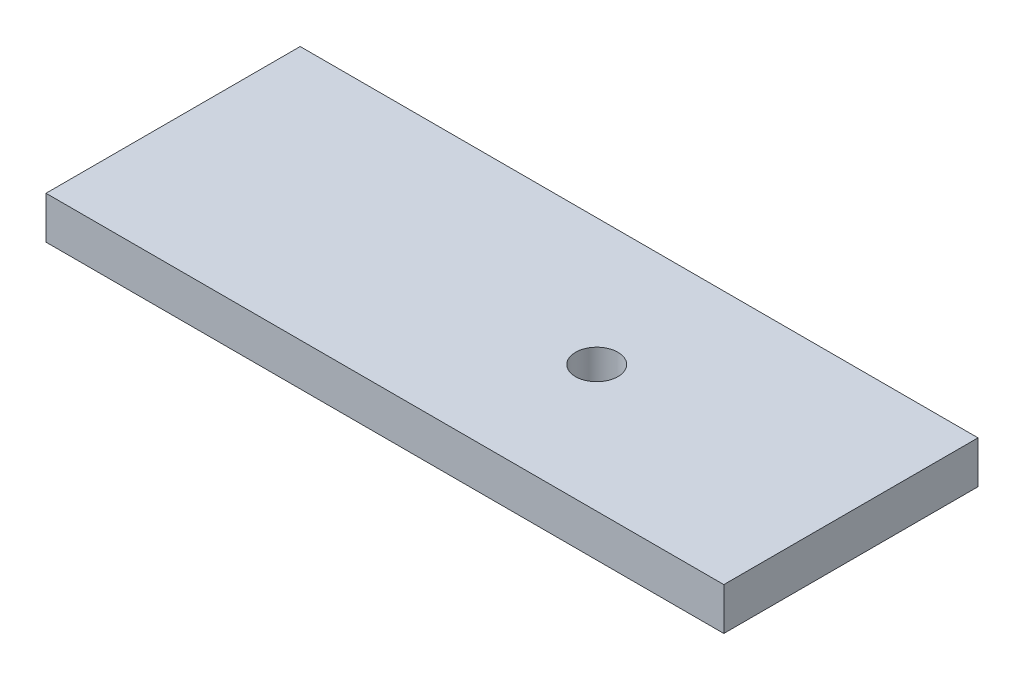
ISO-10303-21;
HEADER;
FILE_DESCRIPTION(('STEP AP214'),'2;1');
FILE_NAME('part.step','',(''),(''),'','','');
FILE_SCHEMA(('AUTOMOTIVE_DESIGN { 1 0 10303 214 1 1 1 1 }'));
ENDSEC;
DATA;
#1=APPLICATION_CONTEXT('core data for automotive mechanical design processes');
#2=APPLICATION_PROTOCOL_DEFINITION('international standard','automotive_design',2000,#1);
#3=PRODUCT_CONTEXT('',#1,'mechanical');
#4=PRODUCT('Part','Part','',(#3));
#5=PRODUCT_RELATED_PRODUCT_CATEGORY('part','',(#4));
#6=PRODUCT_DEFINITION_FORMATION('','',#4);
#7=PRODUCT_DEFINITION_CONTEXT('part definition',#1,'design');
#8=PRODUCT_DEFINITION('design','',#6,#7);
#9=PRODUCT_DEFINITION_SHAPE('','',#8);
#10=(LENGTH_UNIT() NAMED_UNIT(*) SI_UNIT(.MILLI.,.METRE.));
#11=(NAMED_UNIT(*) PLANE_ANGLE_UNIT() SI_UNIT($,.RADIAN.));
#12=(NAMED_UNIT(*) SI_UNIT($,.STERADIAN.) SOLID_ANGLE_UNIT());
#13=UNCERTAINTY_MEASURE_WITH_UNIT(LENGTH_MEASURE(1.E-05),#10,'distance_accuracy_value','');
#14=(GEOMETRIC_REPRESENTATION_CONTEXT(3) GLOBAL_UNCERTAINTY_ASSIGNED_CONTEXT((#13)) GLOBAL_UNIT_ASSIGNED_CONTEXT((#10,
#11,#12)) REPRESENTATION_CONTEXT('',''));
#15=CARTESIAN_POINT('',(0.,0.,0.));
#16=DIRECTION('',(0.,0.,1.));
#17=DIRECTION('',(1.,0.,0.));
#18=AXIS2_PLACEMENT_3D('',#15,#16,#17);
#19=CARTESIAN_POINT('',(0.,3.175,0.));
#20=DIRECTION('',(1.,0.,0.));
#21=DIRECTION('',(0.,0.,-1.));
#22=AXIS2_PLACEMENT_3D('',#19,#20,#21);
#23=PLANE('',#22);
#24=CARTESIAN_POINT('',(0.,1.5875,-13.97));
#25=DIRECTION('',(-1.,0.,0.));
#26=DIRECTION('',(0.,0.,-1.));
#27=AXIS2_PLACEMENT_3D('',#24,#25,#26);
#28=CIRCLE('',#27,1.190625);
#29=CARTESIAN_POINT('',(0.,1.5875,-12.779375));
#30=VERTEX_POINT('',#29);
#31=EDGE_CURVE('E127',#30,#30,#28,.T.);
#32=ORIENTED_EDGE('',*,*,#31,.F.);
#33=EDGE_LOOP('',(#32));
#34=FACE_BOUND('',#33,.T.);
#35=CARTESIAN_POINT('',(0.,1.5875,-5.08));
#36=DIRECTION('',(-1.,0.,0.));
#37=DIRECTION('',(0.,0.,1.));
#38=AXIS2_PLACEMENT_3D('',#35,#36,#37);
#39=CIRCLE('',#38,1.190625);
#40=CARTESIAN_POINT('',(0.,1.5875,-3.889375));
#41=VERTEX_POINT('',#40);
#42=EDGE_CURVE('E121',#41,#41,#39,.T.);
#43=ORIENTED_EDGE('',*,*,#42,.F.);
#44=EDGE_LOOP('',(#43));
#45=FACE_BOUND('',#44,.T.);
#46=DIRECTION('',(0.,0.,1.));
#47=VECTOR('',#46,1.);
#48=CARTESIAN_POINT('',(0.,0.,0.));
#49=LINE('',#48,#47);
#50=CARTESIAN_POINT('',(0.,0.,-19.05));
#51=VERTEX_POINT('',#50);
#52=CARTESIAN_POINT('',(0.,0.,0.));
#53=VERTEX_POINT('',#52);
#54=EDGE_CURVE('E107',#51,#53,#49,.T.);
#55=ORIENTED_EDGE('',*,*,#54,.T.);
#56=DIRECTION('',(0.,-1.,0.));
#57=VECTOR('',#56,1.);
#58=CARTESIAN_POINT('',(0.,3.175,0.));
#59=LINE('',#58,#57);
#60=CARTESIAN_POINT('',(0.,3.175,0.));
#61=VERTEX_POINT('',#60);
#62=EDGE_CURVE('E13',#61,#53,#59,.T.);
#63=ORIENTED_EDGE('',*,*,#62,.F.);
#64=DIRECTION('',(0.,0.,1.));
#65=VECTOR('',#64,1.);
#66=CARTESIAN_POINT('',(0.,3.175,0.));
#67=LINE('',#66,#65);
#68=CARTESIAN_POINT('',(0.,3.175,-19.05));
#69=VERTEX_POINT('',#68);
#70=EDGE_CURVE('E95',#69,#61,#67,.T.);
#71=ORIENTED_EDGE('',*,*,#70,.F.);
#72=DIRECTION('',(0.,-1.,0.));
#73=VECTOR('',#72,1.);
#74=CARTESIAN_POINT('',(0.,3.175,-19.05));
#75=LINE('',#74,#73);
#76=EDGE_CURVE('E103',#69,#51,#75,.T.);
#77=ORIENTED_EDGE('',*,*,#76,.T.);
#78=EDGE_LOOP('',(#55,#63,#71,#77));
#79=FACE_BOUND('',#78,.T.);
#80=ADVANCED_FACE('F44',(#34,#45,#79),#23,.F.);
#81=CARTESIAN_POINT('',(0.,3.175,0.));
#82=DIRECTION('',(0.,0.,-1.));
#83=DIRECTION('',(-1.,0.,0.));
#84=AXIS2_PLACEMENT_3D('',#81,#82,#83);
#85=PLANE('',#84);
#86=DIRECTION('',(1.,0.,0.));
#87=VECTOR('',#86,1.);
#88=CARTESIAN_POINT('',(0.,0.,0.));
#89=LINE('',#88,#87);
#90=CARTESIAN_POINT('',(50.8,0.,0.));
#91=VERTEX_POINT('',#90);
#92=EDGE_CURVE('E99',#53,#91,#89,.T.);
#93=ORIENTED_EDGE('',*,*,#92,.T.);
#94=DIRECTION('',(0.,-1.,0.));
#95=VECTOR('',#94,1.);
#96=CARTESIAN_POINT('',(50.8,3.175,0.));
#97=LINE('',#96,#95);
#98=CARTESIAN_POINT('',(50.8,3.175,0.));
#99=VERTEX_POINT('',#98);
#100=EDGE_CURVE('E52',#99,#91,#97,.T.);
#101=ORIENTED_EDGE('',*,*,#100,.F.);
#102=DIRECTION('',(1.,0.,0.));
#103=VECTOR('',#102,1.);
#104=CARTESIAN_POINT('',(0.,3.175,0.));
#105=LINE('',#104,#103);
#106=EDGE_CURVE('E90',#61,#99,#105,.T.);
#107=ORIENTED_EDGE('',*,*,#106,.F.);
#108=ORIENTED_EDGE('',*,*,#62,.T.);
#109=EDGE_LOOP('',(#93,#101,#107,#108));
#110=FACE_BOUND('',#109,.T.);
#111=ADVANCED_FACE('F98',(#110),#85,.F.);
#112=CARTESIAN_POINT('',(50.8,3.175,0.));
#113=DIRECTION('',(-1.,0.,0.));
#114=DIRECTION('',(0.,0.,1.));
#115=AXIS2_PLACEMENT_3D('',#112,#113,#114);
#116=PLANE('',#115);
#117=DIRECTION('',(0.,0.,-1.));
#118=VECTOR('',#117,1.);
#119=CARTESIAN_POINT('',(50.8,0.,0.));
#120=LINE('',#119,#118);
#121=CARTESIAN_POINT('',(50.8,0.,-19.05));
#122=VERTEX_POINT('',#121);
#123=EDGE_CURVE('E77',#91,#122,#120,.T.);
#124=ORIENTED_EDGE('',*,*,#123,.T.);
#125=DIRECTION('',(0.,-1.,0.));
#126=VECTOR('',#125,1.);
#127=CARTESIAN_POINT('',(50.8,3.175,-19.05));
#128=LINE('',#127,#126);
#129=CARTESIAN_POINT('',(50.8,3.175,-19.05));
#130=VERTEX_POINT('',#129);
#131=EDGE_CURVE('E100',#130,#122,#128,.T.);
#132=ORIENTED_EDGE('',*,*,#131,.F.);
#133=DIRECTION('',(0.,0.,-1.));
#134=VECTOR('',#133,1.);
#135=CARTESIAN_POINT('',(50.8,3.175,0.));
#136=LINE('',#135,#134);
#137=EDGE_CURVE('E93',#99,#130,#136,.T.);
#138=ORIENTED_EDGE('',*,*,#137,.F.);
#139=ORIENTED_EDGE('',*,*,#100,.T.);
#140=EDGE_LOOP('',(#124,#132,#138,#139));
#141=FACE_BOUND('',#140,.T.);
#142=ADVANCED_FACE('F101',(#141),#116,.F.);
#143=CARTESIAN_POINT('',(0.,3.175,-19.05));
#144=DIRECTION('',(0.,0.,1.));
#145=DIRECTION('',(1.,0.,0.));
#146=AXIS2_PLACEMENT_3D('',#143,#144,#145);
#147=PLANE('',#146);
#148=DIRECTION('',(-1.,0.,0.));
#149=VECTOR('',#148,1.);
#150=CARTESIAN_POINT('',(0.,0.,-19.05));
#151=LINE('',#150,#149);
#152=EDGE_CURVE('E83',#122,#51,#151,.T.);
#153=ORIENTED_EDGE('',*,*,#152,.T.);
#154=ORIENTED_EDGE('',*,*,#76,.F.);
#155=DIRECTION('',(-1.,0.,0.));
#156=VECTOR('',#155,1.);
#157=CARTESIAN_POINT('',(0.,3.175,-19.05));
#158=LINE('',#157,#156);
#159=EDGE_CURVE('E60',#130,#69,#158,.T.);
#160=ORIENTED_EDGE('',*,*,#159,.F.);
#161=ORIENTED_EDGE('',*,*,#131,.T.);
#162=EDGE_LOOP('',(#153,#154,#160,#161));
#163=FACE_BOUND('',#162,.T.);
#164=ADVANCED_FACE('F115',(#163),#147,.F.);
#165=CARTESIAN_POINT('',(0.,3.175,0.));
#166=DIRECTION('',(0.,-1.,0.));
#167=DIRECTION('',(0.,0.,-1.));
#168=AXIS2_PLACEMENT_3D('',#165,#166,#167);
#169=PLANE('',#168);
#170=CARTESIAN_POINT('',(31.75,3.175,-9.525));
#171=DIRECTION('',(0.,1.,0.));
#172=DIRECTION('',(0.,0.,1.));
#173=AXIS2_PLACEMENT_3D('',#170,#171,#172);
#174=CIRCLE('',#173,1.5875);
#175=CARTESIAN_POINT('',(31.75,3.175,-7.9375));
#176=VERTEX_POINT('',#175);
#177=EDGE_CURVE('E133',#176,#176,#174,.T.);
#178=ORIENTED_EDGE('',*,*,#177,.F.);
#179=EDGE_LOOP('',(#178));
#180=FACE_BOUND('',#179,.T.);
#181=ORIENTED_EDGE('',*,*,#70,.T.);
#182=ORIENTED_EDGE('',*,*,#106,.T.);
#183=ORIENTED_EDGE('',*,*,#137,.T.);
#184=ORIENTED_EDGE('',*,*,#159,.T.);
#185=EDGE_LOOP('',(#181,#182,#183,#184));
#186=FACE_BOUND('',#185,.T.);
#187=ADVANCED_FACE('F91',(#180,#186),#169,.F.);
#188=CARTESIAN_POINT('',(0.,0.,0.));
#189=DIRECTION('',(0.,-1.,0.));
#190=DIRECTION('',(0.,0.,-1.));
#191=AXIS2_PLACEMENT_3D('',#188,#189,#190);
#192=PLANE('',#191);
#193=CARTESIAN_POINT('',(31.75,0.,-9.525));
#194=DIRECTION('',(0.,1.,0.));
#195=DIRECTION('',(0.,0.,1.));
#196=AXIS2_PLACEMENT_3D('',#193,#194,#195);
#197=CIRCLE('',#196,1.5875);
#198=CARTESIAN_POINT('',(31.75,0.,-7.9375));
#199=VERTEX_POINT('',#198);
#200=EDGE_CURVE('E130',#199,#199,#197,.T.);
#201=ORIENTED_EDGE('',*,*,#200,.T.);
#202=EDGE_LOOP('',(#201));
#203=FACE_BOUND('',#202,.T.);
#204=ORIENTED_EDGE('',*,*,#54,.F.);
#205=ORIENTED_EDGE('',*,*,#152,.F.);
#206=ORIENTED_EDGE('',*,*,#123,.F.);
#207=ORIENTED_EDGE('',*,*,#92,.F.);
#208=EDGE_LOOP('',(#204,#205,#206,#207));
#209=FACE_BOUND('',#208,.T.);
#210=ADVANCED_FACE('F118',(#203,#209),#192,.T.);
#211=CARTESIAN_POINT('',(9.525,1.5875,-5.08));
#212=DIRECTION('',(-1.,0.,0.));
#213=DIRECTION('',(0.,0.,1.));
#214=AXIS2_PLACEMENT_3D('',#211,#212,#213);
#215=CYLINDRICAL_SURFACE('',#214,1.190625);
#216=CARTESIAN_POINT('',(9.525,1.5875,-5.08));
#217=DIRECTION('',(-1.,0.,0.));
#218=DIRECTION('',(0.,0.,1.));
#219=AXIS2_PLACEMENT_3D('',#216,#217,#218);
#220=CIRCLE('',#219,1.190625);
#221=CARTESIAN_POINT('',(9.525,1.5875,-3.889375));
#222=VERTEX_POINT('',#221);
#223=EDGE_CURVE('E110',#222,#222,#220,.T.);
#224=CARTESIAN_POINT('',(9.525,1.5875,-3.889375));
#225=CARTESIAN_POINT('',(9.42578125,1.5875,-3.889375));
#226=CARTESIAN_POINT('',(9.3265625,1.5875,-3.889375));
#227=CARTESIAN_POINT('',(9.128125,1.5875,-3.889375));
#228=CARTESIAN_POINT('',(9.02890625,1.5875,-3.889375));
#229=CARTESIAN_POINT('',(8.83046875,1.5875,-3.889375));
#230=CARTESIAN_POINT('',(8.73125,1.5875,-3.889375));
#231=CARTESIAN_POINT('',(8.5328125,1.5875,-3.889375));
#232=CARTESIAN_POINT('',(8.43359375,1.5875,-3.889375));
#233=CARTESIAN_POINT('',(8.23515625,1.5875,-3.889375));
#234=CARTESIAN_POINT('',(8.1359375,1.5875,-3.889375));
#235=CARTESIAN_POINT('',(7.9375,1.5875,-3.889375));
#236=CARTESIAN_POINT('',(7.83828125,1.5875,-3.889375));
#237=CARTESIAN_POINT('',(7.63984375,1.5875,-3.889375));
#238=CARTESIAN_POINT('',(7.540625,1.5875,-3.889375));
#239=CARTESIAN_POINT('',(7.3421875,1.5875,-3.889375));
#240=CARTESIAN_POINT('',(7.24296875,1.5875,-3.889375));
#241=CARTESIAN_POINT('',(7.04453125,1.5875,-3.889375));
#242=CARTESIAN_POINT('',(6.9453125,1.5875,-3.889375));
#243=CARTESIAN_POINT('',(6.746875,1.5875,-3.889375));
#244=CARTESIAN_POINT('',(6.64765625,1.5875,-3.889375));
#245=CARTESIAN_POINT('',(6.44921875,1.5875,-3.889375));
#246=CARTESIAN_POINT('',(6.35,1.5875,-3.889375));
#247=CARTESIAN_POINT('',(6.1515625,1.5875,-3.889375));
#248=CARTESIAN_POINT('',(6.05234375,1.5875,-3.889375));
#249=CARTESIAN_POINT('',(5.85390625,1.5875,-3.889375));
#250=CARTESIAN_POINT('',(5.7546875,1.5875,-3.889375));
#251=CARTESIAN_POINT('',(5.55625,1.5875,-3.889375));
#252=CARTESIAN_POINT('',(5.45703125,1.5875,-3.889375));
#253=CARTESIAN_POINT('',(5.25859375,1.5875,-3.889375));
#254=CARTESIAN_POINT('',(5.159375,1.5875,-3.889375));
#255=CARTESIAN_POINT('',(4.9609375,1.5875,-3.889375));
#256=CARTESIAN_POINT('',(4.86171875,1.5875,-3.889375));
#257=CARTESIAN_POINT('',(4.66328125,1.5875,-3.889375));
#258=CARTESIAN_POINT('',(4.5640625,1.5875,-3.889375));
#259=CARTESIAN_POINT('',(4.365625,1.5875,-3.889375));
#260=CARTESIAN_POINT('',(4.26640625,1.5875,-3.889375));
#261=CARTESIAN_POINT('',(4.06796875,1.5875,-3.889375));
#262=CARTESIAN_POINT('',(3.96875,1.5875,-3.889375));
#263=CARTESIAN_POINT('',(3.7703125,1.5875,-3.889375));
#264=CARTESIAN_POINT('',(3.67109375,1.5875,-3.889375));
#265=CARTESIAN_POINT('',(3.47265625,1.5875,-3.889375));
#266=CARTESIAN_POINT('',(3.3734375,1.5875,-3.889375));
#267=CARTESIAN_POINT('',(3.175,1.5875,-3.889375));
#268=CARTESIAN_POINT('',(3.07578125,1.5875,-3.889375));
#269=CARTESIAN_POINT('',(2.87734375,1.5875,-3.889375));
#270=CARTESIAN_POINT('',(2.778125,1.5875,-3.889375));
#271=CARTESIAN_POINT('',(2.5796875,1.5875,-3.889375));
#272=CARTESIAN_POINT('',(2.48046875,1.5875,-3.889375));
#273=CARTESIAN_POINT('',(2.28203125,1.5875,-3.889375));
#274=CARTESIAN_POINT('',(2.1828125,1.5875,-3.889375));
#275=CARTESIAN_POINT('',(1.984375,1.5875,-3.889375));
#276=CARTESIAN_POINT('',(1.88515625,1.5875,-3.889375));
#277=CARTESIAN_POINT('',(1.68671875,1.5875,-3.889375));
#278=CARTESIAN_POINT('',(1.5875,1.5875,-3.889375));
#279=CARTESIAN_POINT('',(1.3890625,1.5875,-3.889375));
#280=CARTESIAN_POINT('',(1.28984375,1.5875,-3.889375));
#281=CARTESIAN_POINT('',(1.09140625,1.5875,-3.889375));
#282=CARTESIAN_POINT('',(0.992187500000001,1.5875,-3.889375));
#283=CARTESIAN_POINT('',(0.793750000000001,1.5875,-3.889375));
#284=CARTESIAN_POINT('',(0.69453125,1.5875,-3.889375));
#285=CARTESIAN_POINT('',(0.49609375,1.5875,-3.889375));
#286=CARTESIAN_POINT('',(0.396875,1.5875,-3.889375));
#287=CARTESIAN_POINT('',(0.1984375,1.5875,-3.889375));
#288=CARTESIAN_POINT('',(0.0992187500000001,1.5875,-3.889375));
#289=CARTESIAN_POINT('',(0.,1.5875,-3.889375));
#290=B_SPLINE_CURVE_WITH_KNOTS('',3,(#224,#225,#226,#227,#228,#229,#230,#231,#232,#233,#234,
#235,#236,#237,#238,#239,#240,#241,#242,#243,#244,#245,#246,#247,#248,#249,#250,#251,#252,#253,
#254,#255,#256,#257,#258,#259,#260,#261,#262,#263,#264,#265,#266,#267,#268,#269,#270,#271,#272,
#273,#274,#275,#276,#277,#278,#279,#280,#281,#282,#283,#284,#285,#286,#287,#288,#289),
.UNSPECIFIED.,.F.,.F.,(4,2,2,2,2,2,2,2,2,2,2,2,2,2,2,2,2,2,2,2,2,2,2,2,2,2,2,2,2,2,2,2,4),(0.,
0.297656249999998,0.595312499999999,0.892968749999999,1.190625,1.48828125,1.7859375,2.08359375,
2.38125,2.67890625,2.9765625,3.27421875,3.571875,3.86953125,4.1671875,4.46484375,4.7625,
5.06015625,5.3578125,5.65546875,5.953125,6.25078125,6.5484375,6.84609375,7.14375,7.44140625,
7.7390625,8.03671875,8.334375,8.63203125,8.9296875,9.22734375,9.525),.UNSPECIFIED.);
#291=EDGE_CURVE('BSEAM153',#222,#41,#290,.T.);
#292=ORIENTED_EDGE('',*,*,#223,.F.);
#293=ORIENTED_EDGE('',*,*,#42,.T.);
#294=ORIENTED_EDGE('',*,*,#291,.T.);
#295=ORIENTED_EDGE('',*,*,#291,.F.);
#296=EDGE_LOOP('',(#292,#294,#293,#295));
#297=FACE_BOUND('',#296,.T.);
#298=ADVANCED_FACE('F153',(#297),#215,.F.);
#299=CARTESIAN_POINT('',(9.525,1.5875,-5.08));
#300=DIRECTION('',(-1.,0.,0.));
#301=DIRECTION('',(0.,0.,1.));
#302=AXIS2_PLACEMENT_3D('',#299,#300,#301);
#303=PLANE('',#302);
#304=ORIENTED_EDGE('',*,*,#223,.T.);
#305=EDGE_LOOP('',(#304));
#306=FACE_BOUND('',#305,.T.);
#307=ADVANCED_FACE('F167',(#306),#303,.T.);
#308=CARTESIAN_POINT('',(9.525,1.5875,-13.97));
#309=DIRECTION('',(-1.,0.,0.));
#310=DIRECTION('',(0.,0.,1.));
#311=AXIS2_PLACEMENT_3D('',#308,#309,#310);
#312=CYLINDRICAL_SURFACE('',#311,1.190625);
#313=CARTESIAN_POINT('',(9.525,1.5875,-13.97));
#314=DIRECTION('',(-1.,0.,0.));
#315=DIRECTION('',(0.,0.,-1.));
#316=AXIS2_PLACEMENT_3D('',#313,#314,#315);
#317=CIRCLE('',#316,1.190625);
#318=CARTESIAN_POINT('',(9.525,1.5875,-12.779375));
#319=VERTEX_POINT('',#318);
#320=EDGE_CURVE('E124',#319,#319,#317,.T.);
#321=CARTESIAN_POINT('',(9.525,1.5875,-12.779375));
#322=CARTESIAN_POINT('',(9.42578125,1.5875,-12.779375));
#323=CARTESIAN_POINT('',(9.3265625,1.5875,-12.779375));
#324=CARTESIAN_POINT('',(9.128125,1.5875,-12.779375));
#325=CARTESIAN_POINT('',(9.02890625,1.5875,-12.779375));
#326=CARTESIAN_POINT('',(8.83046875,1.5875,-12.779375));
#327=CARTESIAN_POINT('',(8.73125,1.5875,-12.779375));
#328=CARTESIAN_POINT('',(8.5328125,1.5875,-12.779375));
#329=CARTESIAN_POINT('',(8.43359375,1.5875,-12.779375));
#330=CARTESIAN_POINT('',(8.23515625,1.5875,-12.779375));
#331=CARTESIAN_POINT('',(8.1359375,1.5875,-12.779375));
#332=CARTESIAN_POINT('',(7.9375,1.5875,-12.779375));
#333=CARTESIAN_POINT('',(7.83828125,1.5875,-12.779375));
#334=CARTESIAN_POINT('',(7.63984375,1.5875,-12.779375));
#335=CARTESIAN_POINT('',(7.540625,1.5875,-12.779375));
#336=CARTESIAN_POINT('',(7.3421875,1.5875,-12.779375));
#337=CARTESIAN_POINT('',(7.24296875,1.5875,-12.779375));
#338=CARTESIAN_POINT('',(7.04453125,1.5875,-12.779375));
#339=CARTESIAN_POINT('',(6.9453125,1.5875,-12.779375));
#340=CARTESIAN_POINT('',(6.746875,1.5875,-12.779375));
#341=CARTESIAN_POINT('',(6.64765625,1.5875,-12.779375));
#342=CARTESIAN_POINT('',(6.44921875,1.5875,-12.779375));
#343=CARTESIAN_POINT('',(6.35,1.5875,-12.779375));
#344=CARTESIAN_POINT('',(6.1515625,1.5875,-12.779375));
#345=CARTESIAN_POINT('',(6.05234375,1.5875,-12.779375));
#346=CARTESIAN_POINT('',(5.85390625,1.5875,-12.779375));
#347=CARTESIAN_POINT('',(5.7546875,1.5875,-12.779375));
#348=CARTESIAN_POINT('',(5.55625,1.5875,-12.779375));
#349=CARTESIAN_POINT('',(5.45703125,1.5875,-12.779375));
#350=CARTESIAN_POINT('',(5.25859375,1.5875,-12.779375));
#351=CARTESIAN_POINT('',(5.159375,1.5875,-12.779375));
#352=CARTESIAN_POINT('',(4.9609375,1.5875,-12.779375));
#353=CARTESIAN_POINT('',(4.86171875,1.5875,-12.779375));
#354=CARTESIAN_POINT('',(4.66328125,1.5875,-12.779375));
#355=CARTESIAN_POINT('',(4.5640625,1.5875,-12.779375));
#356=CARTESIAN_POINT('',(4.365625,1.5875,-12.779375));
#357=CARTESIAN_POINT('',(4.26640625,1.5875,-12.779375));
#358=CARTESIAN_POINT('',(4.06796875,1.5875,-12.779375));
#359=CARTESIAN_POINT('',(3.96875,1.5875,-12.779375));
#360=CARTESIAN_POINT('',(3.7703125,1.5875,-12.779375));
#361=CARTESIAN_POINT('',(3.67109375,1.5875,-12.779375));
#362=CARTESIAN_POINT('',(3.47265625,1.5875,-12.779375));
#363=CARTESIAN_POINT('',(3.3734375,1.5875,-12.779375));
#364=CARTESIAN_POINT('',(3.175,1.5875,-12.779375));
#365=CARTESIAN_POINT('',(3.07578125,1.5875,-12.779375));
#366=CARTESIAN_POINT('',(2.87734375,1.5875,-12.779375));
#367=CARTESIAN_POINT('',(2.778125,1.5875,-12.779375));
#368=CARTESIAN_POINT('',(2.5796875,1.5875,-12.779375));
#369=CARTESIAN_POINT('',(2.48046875,1.5875,-12.779375));
#370=CARTESIAN_POINT('',(2.28203125,1.5875,-12.779375));
#371=CARTESIAN_POINT('',(2.1828125,1.5875,-12.779375));
#372=CARTESIAN_POINT('',(1.984375,1.5875,-12.779375));
#373=CARTESIAN_POINT('',(1.88515625,1.5875,-12.779375));
#374=CARTESIAN_POINT('',(1.68671875,1.5875,-12.779375));
#375=CARTESIAN_POINT('',(1.5875,1.5875,-12.779375));
#376=CARTESIAN_POINT('',(1.3890625,1.5875,-12.779375));
#377=CARTESIAN_POINT('',(1.28984375,1.5875,-12.779375));
#378=CARTESIAN_POINT('',(1.09140625,1.5875,-12.779375));
#379=CARTESIAN_POINT('',(0.992187500000001,1.5875,-12.779375));
#380=CARTESIAN_POINT('',(0.793750000000001,1.5875,-12.779375));
#381=CARTESIAN_POINT('',(0.69453125,1.5875,-12.779375));
#382=CARTESIAN_POINT('',(0.49609375,1.5875,-12.779375));
#383=CARTESIAN_POINT('',(0.396875,1.5875,-12.779375));
#384=CARTESIAN_POINT('',(0.1984375,1.5875,-12.779375));
#385=CARTESIAN_POINT('',(0.0992187500000001,1.5875,-12.779375));
#386=CARTESIAN_POINT('',(0.,1.5875,-12.779375));
#387=B_SPLINE_CURVE_WITH_KNOTS('',3,(#321,#322,#323,#324,#325,#326,#327,#328,#329,#330,#331,
#332,#333,#334,#335,#336,#337,#338,#339,#340,#341,#342,#343,#344,#345,#346,#347,#348,#349,#350,
#351,#352,#353,#354,#355,#356,#357,#358,#359,#360,#361,#362,#363,#364,#365,#366,#367,#368,#369,
#370,#371,#372,#373,#374,#375,#376,#377,#378,#379,#380,#381,#382,#383,#384,#385,#386),
.UNSPECIFIED.,.F.,.F.,(4,2,2,2,2,2,2,2,2,2,2,2,2,2,2,2,2,2,2,2,2,2,2,2,2,2,2,2,2,2,2,2,4),(0.,
0.297656249999998,0.595312499999999,0.892968749999999,1.190625,1.48828125,1.7859375,2.08359375,
2.38125,2.67890625,2.9765625,3.27421875,3.571875,3.86953125,4.1671875,4.46484375,4.7625,
5.06015625,5.3578125,5.65546875,5.953125,6.25078125,6.5484375,6.84609375,7.14375,7.44140625,
7.7390625,8.03671875,8.334375,8.63203125,8.9296875,9.22734375,9.525),.UNSPECIFIED.);
#388=EDGE_CURVE('BSEAM172',#319,#30,#387,.T.);
#389=ORIENTED_EDGE('',*,*,#320,.F.);
#390=ORIENTED_EDGE('',*,*,#31,.T.);
#391=ORIENTED_EDGE('',*,*,#388,.T.);
#392=ORIENTED_EDGE('',*,*,#388,.F.);
#393=EDGE_LOOP('',(#389,#391,#390,#392));
#394=FACE_BOUND('',#393,.T.);
#395=ADVANCED_FACE('F172',(#394),#312,.F.);
#396=CARTESIAN_POINT('',(9.525,1.5875,-13.97));
#397=DIRECTION('',(1.,0.,0.));
#398=DIRECTION('',(0.,0.,-1.));
#399=AXIS2_PLACEMENT_3D('',#396,#397,#398);
#400=PLANE('',#399);
#401=ORIENTED_EDGE('',*,*,#320,.T.);
#402=EDGE_LOOP('',(#401));
#403=FACE_BOUND('',#402,.T.);
#404=ADVANCED_FACE('F143',(#403),#400,.F.);
#405=CARTESIAN_POINT('',(31.75,0.,-9.525));
#406=DIRECTION('',(0.,1.,0.));
#407=DIRECTION('',(0.,0.,1.));
#408=AXIS2_PLACEMENT_3D('',#405,#406,#407);
#409=CYLINDRICAL_SURFACE('',#408,1.5875);
#410=ORIENTED_EDGE('',*,*,#200,.F.);
#411=EDGE_LOOP('',(#410));
#412=FACE_BOUND('',#411,.T.);
#413=ORIENTED_EDGE('',*,*,#177,.T.);
#414=EDGE_LOOP('',(#413));
#415=FACE_BOUND('',#414,.T.);
#416=ADVANCED_FACE('F140',(#412,#415),#409,.F.);
#417=CLOSED_SHELL('',(#80,#111,#142,#164,#187,#210,#298,#307,#395,#404,#416));
#418=MANIFOLD_SOLID_BREP('B2',#417);
#419=ADVANCED_BREP_SHAPE_REPRESENTATION('',(#18,#418),#14);
#420=SHAPE_DEFINITION_REPRESENTATION(#9,#419);
ENDSEC;
END-ISO-10303-21;
